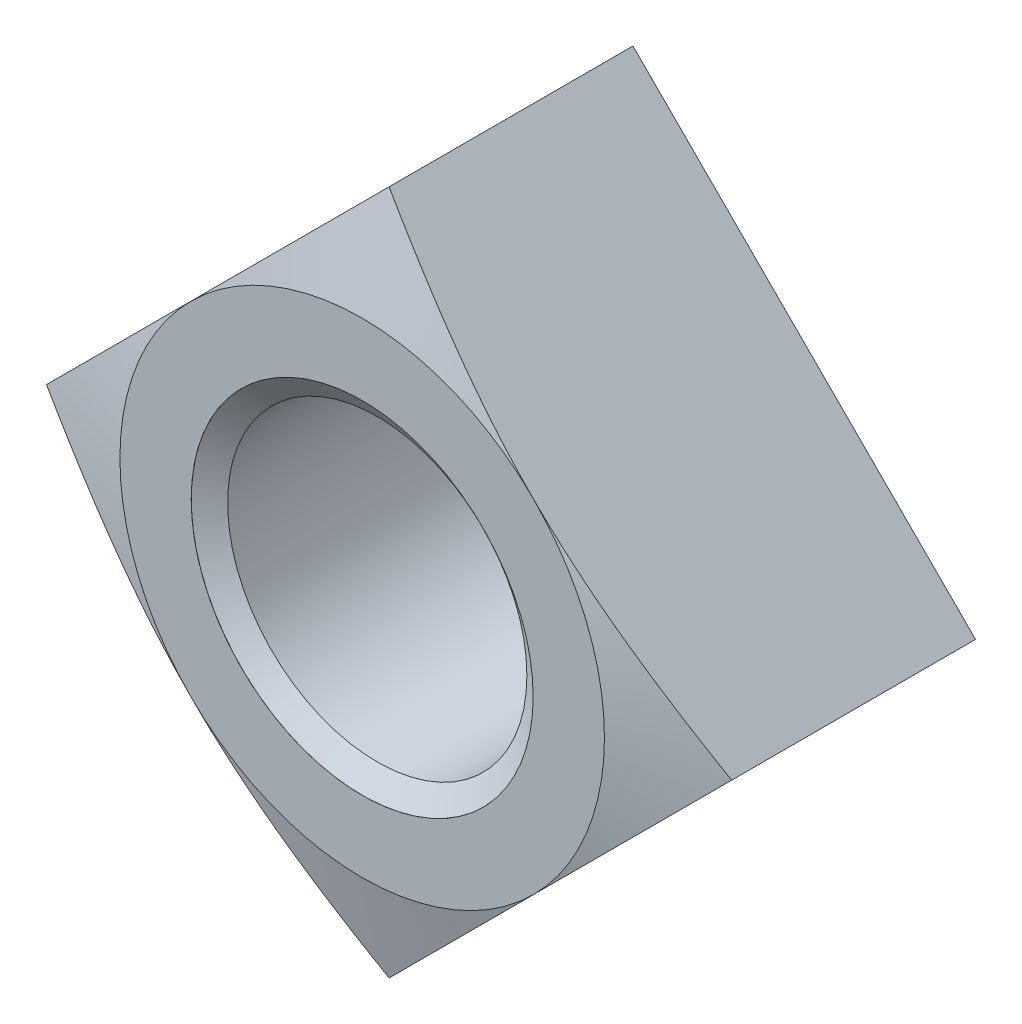
ISO-10303-21;
HEADER;
FILE_DESCRIPTION(('STEP AP214'),'2;1');
FILE_NAME('part.step','',(''),(''),'','','');
FILE_SCHEMA(('AUTOMOTIVE_DESIGN { 1 0 10303 214 1 1 1 1 }'));
ENDSEC;
DATA;
#1=APPLICATION_CONTEXT('core data for automotive mechanical design processes');
#2=APPLICATION_PROTOCOL_DEFINITION('international standard','automotive_design',2000,#1);
#3=PRODUCT_CONTEXT('',#1,'mechanical');
#4=PRODUCT('Part','Part','',(#3));
#5=PRODUCT_RELATED_PRODUCT_CATEGORY('part','',(#4));
#6=PRODUCT_DEFINITION_FORMATION('','',#4);
#7=PRODUCT_DEFINITION_CONTEXT('part definition',#1,'design');
#8=PRODUCT_DEFINITION('design','',#6,#7);
#9=PRODUCT_DEFINITION_SHAPE('','',#8);
#10=(LENGTH_UNIT() NAMED_UNIT(*) SI_UNIT(.MILLI.,.METRE.));
#11=(NAMED_UNIT(*) PLANE_ANGLE_UNIT() SI_UNIT($,.RADIAN.));
#12=(NAMED_UNIT(*) SI_UNIT($,.STERADIAN.) SOLID_ANGLE_UNIT());
#13=UNCERTAINTY_MEASURE_WITH_UNIT(LENGTH_MEASURE(1.E-05),#10,'distance_accuracy_value','');
#14=(GEOMETRIC_REPRESENTATION_CONTEXT(3) GLOBAL_UNCERTAINTY_ASSIGNED_CONTEXT((#13)) GLOBAL_UNIT_ASSIGNED_CONTEXT((#10,
#11,#12)) REPRESENTATION_CONTEXT('',''));
#15=CARTESIAN_POINT('',(0.,0.,0.));
#16=DIRECTION('',(0.,0.,1.));
#17=DIRECTION('',(1.,0.,0.));
#18=AXIS2_PLACEMENT_3D('',#15,#16,#17);
#19=CARTESIAN_POINT('',(0.,0.,-19.));
#20=DIRECTION('',(0.,0.,1.));
#21=DIRECTION('',(1.,0.,0.));
#22=AXIS2_PLACEMENT_3D('',#19,#20,#21);
#23=CYLINDRICAL_SURFACE('',#22,10.5);
#24=CARTESIAN_POINT('',(0.,0.,-1.05831130731455));
#25=DIRECTION('',(0.,0.,1.));
#26=DIRECTION('',(1.,0.,0.));
#27=AXIS2_PLACEMENT_3D('',#24,#25,#26);
#28=CIRCLE('',#27,10.5);
#29=CARTESIAN_POINT('',(10.5,0.,-1.05831130731455));
#30=VERTEX_POINT('',#29);
#31=EDGE_CURVE('E171',#30,#30,#28,.F.);
#32=ORIENTED_EDGE('',*,*,#31,.F.);
#33=EDGE_LOOP('',(#32));
#34=FACE_BOUND('',#33,.T.);
#35=CARTESIAN_POINT('',(0.,0.,-17.9406886926854));
#36=DIRECTION('',(0.,0.,-1.));
#37=DIRECTION('',(-1.,0.,0.));
#38=AXIS2_PLACEMENT_3D('',#35,#36,#37);
#39=CIRCLE('',#38,10.5);
#40=CARTESIAN_POINT('',(-10.5,0.,-17.9406886926854));
#41=VERTEX_POINT('',#40);
#42=EDGE_CURVE('E39',#41,#41,#39,.F.);
#43=ORIENTED_EDGE('',*,*,#42,.F.);
#44=EDGE_LOOP('',(#43));
#45=FACE_BOUND('',#44,.T.);
#46=ADVANCED_FACE('F34',(#34,#45),#23,.F.);
#47=CARTESIAN_POINT('',(0.,-24.0416305603426,-19.));
#48=DIRECTION('',(0.707106781186548,-0.707106781186547,0.));
#49=DIRECTION('',(0.707106781186547,0.707106781186548,0.));
#50=AXIS2_PLACEMENT_3D('',#47,#48,#49);
#51=PLANE('',#50);
#52=DIRECTION('',(0.,0.,1.));
#53=VECTOR('',#52,1.);
#54=CARTESIAN_POINT('',(24.0416305603426,0.,-19.));
#55=LINE('',#54,#53);
#56=CARTESIAN_POINT('',(24.0416305603426,0.,-19.));
#57=VERTEX_POINT('',#56);
#58=CARTESIAN_POINT('',(24.0416305603426,0.,-1.88679922204209));
#59=VERTEX_POINT('',#58);
#60=EDGE_CURVE('E163',#57,#59,#55,.T.);
#61=ORIENTED_EDGE('',*,*,#60,.T.);
#62=CARTESIAN_POINT('',(24.0418305603426,0.000200000000000547,-1.88685281210348));
#63=CARTESIAN_POINT('',(23.6810411055927,-0.360589454749866,-1.7901955422523));
#64=CARTESIAN_POINT('',(23.3199703646757,-0.721660195666852,-1.69560617213366));
#65=CARTESIAN_POINT('',(22.5971946492389,-1.44443591110365,-1.51127094193264));
#66=CARTESIAN_POINT('',(22.2354896459195,-1.80614091442308,-1.42152530799281));
#67=CARTESIAN_POINT('',(21.5111693163841,-2.5304612439585,-1.24753722288939));
#68=CARTESIAN_POINT('',(21.1485535479555,-2.89307701238706,-1.16329842941685));
#69=CARTESIAN_POINT('',(20.4226152754532,-3.61901528488943,-1.00123125126152));
#70=CARTESIAN_POINT('',(20.059292779392,-3.98233778095055,-0.92340279432868));
#71=CARTESIAN_POINT('',(18.9673670870529,-5.07426347328974,-0.700735025456504));
#72=CARTESIAN_POINT('',(18.2375962862967,-5.80403427404588,-0.566907203137075));
#73=CARTESIAN_POINT('',(17.1408011063925,-6.90082945395011,-0.394369210461961));
#74=CARTESIAN_POINT('',(16.7748732833449,-7.26675727699767,-0.341560024747929));
#75=CARTESIAN_POINT('',(16.0423433673301,-7.99928719301251,-0.24638041855238));
#76=CARTESIAN_POINT('',(15.6757412969734,-8.3658892633692,-0.204009654228861));
#77=CARTESIAN_POINT('',(14.9475096922545,-9.09412086808808,-0.131203886049738));
#78=CARTESIAN_POINT('',(14.5858887370372,-9.45574182330535,-0.100598181356072));
#79=CARTESIAN_POINT('',(13.8622417937111,-10.1793887666315,-0.0511623306157504));
#80=CARTESIAN_POINT('',(13.5002158065039,-10.5414147538387,-0.0323321584084118));
#81=CARTESIAN_POINT('',(12.7759417601421,-11.2656888002005,-0.00693322575574935));
#82=CARTESIAN_POINT('',(12.4136936978842,-11.6279368624584,-0.00036464075617388));
#83=CARTESIAN_POINT('',(11.68919235968,-12.3524382006626,0.000335069963156791));
#84=CARTESIAN_POINT('',(11.3269390837408,-12.7146914766018,-0.00553378866484579));
#85=CARTESIAN_POINT('',(10.6030026862981,-13.4386278740445,-0.0295412472541509));
#86=CARTESIAN_POINT('',(10.2413193587041,-13.8003112016385,-0.047667431293936));
#87=CARTESIAN_POINT('',(9.51835087963272,-14.5232796807099,-0.0957014604715472));
#88=CARTESIAN_POINT('',(9.15706573088783,-14.8845648294548,-0.12560938596275));
#89=CARTESIAN_POINT('',(8.07403908147058,-15.967591478872,-0.231960594779019));
#90=CARTESIAN_POINT('',(7.35308599932998,-16.6885445610126,-0.325032791109208));
#91=CARTESIAN_POINT('',(6.35641213329721,-17.6852184270454,-0.479473928689032));
#92=CARTESIAN_POINT('',(6.07939888362192,-17.9622316767207,-0.525167593839492));
#93=CARTESIAN_POINT('',(5.52582325233106,-18.5158073080115,-0.621550334840829));
#94=CARTESIAN_POINT('',(5.24926083918922,-18.7923697211534,-0.672239044697153));
#95=CARTESIAN_POINT('',(4.42016185809684,-19.6214687022458,-0.831140111044615));
#96=CARTESIAN_POINT('',(3.8682783950685,-20.1733521652741,-0.94617714320734));
#97=CARTESIAN_POINT('',(2.76265174549762,-21.278978814845,-1.19188048125466));
#98=CARTESIAN_POINT('',(2.20891926705389,-21.8327112932887,-1.32264211667029));
#99=CARTESIAN_POINT('',(1.37955839928319,-22.6620721610594,-1.52787262488177));
#100=CARTESIAN_POINT('',(1.1033603130542,-22.9382702472884,-1.59778417037341));
#101=CARTESIAN_POINT('',(0.551320402310434,-23.4903101580322,-1.74034210311989));
#102=CARTESIAN_POINT('',(0.275478573595275,-23.7661519867473,-1.81298845782032));
#103=CARTESIAN_POINT('',(-0.000200000000008303,-24.0418305603426,-1.88685281210348));
#104=B_SPLINE_CURVE_WITH_KNOTS('',3,(#62,#63,#64,#65,#66,#67,#68,#69,#70,#71,#72,#73,#74,#75,
#76,#77,#78,#79,#80,#81,#82,#83,#84,#85,#86,#87,#88,#89,#90,#91,#92,#93,#94,#95,#96,#97,#98,#99,
#100,#101,#102,#103),.UNSPECIFIED.,.F.,.F.,(4,2,2,2,2,2,2,2,2,2,2,2,2,2,2,2,2,2,2,2,4),(0.,
1.55792765895249,3.11592799104219,4.67495286100678,6.23396015700522,9.35537810496539,
10.9158569194478,12.4762843248233,14.0131299734936,15.5499722078745,17.0868364320978,
18.6236987222132,20.159006592055,21.6943249331254,24.7647903972788,25.948012582156,
27.1311481349084,29.4976960010644,31.8793921299765,33.0698149689814,34.2602236419983),.UNSPECIFIED.);
#105=CARTESIAN_POINT('',(12.0208152801713,-12.0208152801713,0.));
#106=VERTEX_POINT('',#105);
#107=EDGE_CURVE('E151',#59,#106,#104,.T.);
#108=ORIENTED_EDGE('',*,*,#107,.T.);
#109=CARTESIAN_POINT('',(0.,-24.0416305603426,-1.88679922204209));
#110=VERTEX_POINT('',#109);
#111=EDGE_CURVE('E60',#106,#110,#104,.T.);
#112=ORIENTED_EDGE('',*,*,#111,.T.);
#113=DIRECTION('',(0.,0.,1.));
#114=VECTOR('',#113,1.);
#115=CARTESIAN_POINT('',(0.,-24.0416305603426,-19.));
#116=LINE('',#115,#114);
#117=CARTESIAN_POINT('',(0.,-24.0416305603426,-19.));
#118=VERTEX_POINT('',#117);
#119=EDGE_CURVE('E111',#118,#110,#116,.T.);
#120=ORIENTED_EDGE('',*,*,#119,.F.);
#121=DIRECTION('',(0.707106781186547,0.707106781186548,0.));
#122=VECTOR('',#121,1.);
#123=CARTESIAN_POINT('',(0.,-24.0416305603426,-19.));
#124=LINE('',#123,#122);
#125=EDGE_CURVE('E152',#118,#57,#124,.T.);
#126=ORIENTED_EDGE('',*,*,#125,.T.);
#127=EDGE_LOOP('',(#61,#108,#112,#120,#126));
#128=FACE_BOUND('',#127,.T.);
#129=ADVANCED_FACE('F36',(#128),#51,.T.);
#130=CARTESIAN_POINT('',(-24.0416305603426,0.,-19.));
#131=DIRECTION('',(-0.707106781186548,-0.707106781186547,0.));
#132=DIRECTION('',(0.707106781186547,-0.707106781186548,0.));
#133=AXIS2_PLACEMENT_3D('',#130,#131,#132);
#134=PLANE('',#133);
#135=ORIENTED_EDGE('',*,*,#119,.T.);
#136=CARTESIAN_POINT('',(0.00019999999999076,-24.0418305603426,-1.88685281210348));
#137=CARTESIAN_POINT('',(-0.360589454749876,-23.6810411055927,-1.79019554225231));
#138=CARTESIAN_POINT('',(-0.721660195666861,-23.3199703646758,-1.69560617213366));
#139=CARTESIAN_POINT('',(-1.44443591110366,-22.597194649239,-1.51127094193264));
#140=CARTESIAN_POINT('',(-1.80614091442309,-22.2354896459195,-1.42152530799281));
#141=CARTESIAN_POINT('',(-2.53046124395851,-21.5111693163841,-1.24753722288939));
#142=CARTESIAN_POINT('',(-2.89307701238707,-21.1485535479556,-1.16329842941685));
#143=CARTESIAN_POINT('',(-3.61901528488944,-20.4226152754532,-1.00123125126152));
#144=CARTESIAN_POINT('',(-3.98233778095056,-20.0592927793921,-0.923402794328685));
#145=CARTESIAN_POINT('',(-5.07426347328975,-18.9673670870529,-0.700735025456508));
#146=CARTESIAN_POINT('',(-5.80403427404589,-18.2375962862967,-0.566907203137081));
#147=CARTESIAN_POINT('',(-6.90082945395012,-17.1408011063925,-0.394369210461966));
#148=CARTESIAN_POINT('',(-7.26675727699768,-16.7748732833449,-0.341560024747933));
#149=CARTESIAN_POINT('',(-7.99928719301252,-16.0423433673301,-0.246380418552383));
#150=CARTESIAN_POINT('',(-8.36588926336921,-15.6757412969734,-0.204009654228866));
#151=CARTESIAN_POINT('',(-9.09412086808809,-14.9475096922545,-0.131203886049742));
#152=CARTESIAN_POINT('',(-9.45574182330536,-14.5858887370373,-0.100598181356076));
#153=CARTESIAN_POINT('',(-10.1793887666315,-13.8622417937111,-0.0511623306157539));
#154=CARTESIAN_POINT('',(-10.5414147538387,-13.5002158065039,-0.0323321584084156));
#155=CARTESIAN_POINT('',(-11.2656888002005,-12.7759417601421,-0.00693322575575295));
#156=CARTESIAN_POINT('',(-11.6279368624584,-12.4136936978842,-0.000364640756177037));
#157=CARTESIAN_POINT('',(-12.3524382006627,-11.68919235968,0.000335069963153438));
#158=CARTESIAN_POINT('',(-12.7146914766018,-11.3269390837408,-0.00553378866484968));
#159=CARTESIAN_POINT('',(-13.4386278740445,-10.6030026862981,-0.0295412472541545));
#160=CARTESIAN_POINT('',(-13.8003112016385,-10.2413193587041,-0.0476674312939388));
#161=CARTESIAN_POINT('',(-14.5232796807099,-9.51835087963272,-0.0957014604715495));
#162=CARTESIAN_POINT('',(-14.8845648294548,-9.15706573088784,-0.125609385962753));
#163=CARTESIAN_POINT('',(-15.967591478872,-8.07403908147058,-0.231960594779022));
#164=CARTESIAN_POINT('',(-16.6885445610126,-7.35308599932998,-0.325032791109213));
#165=CARTESIAN_POINT('',(-17.6852184270454,-6.3564121332972,-0.479473928689036));
#166=CARTESIAN_POINT('',(-17.9622316767207,-6.07939888362192,-0.525167593839495));
#167=CARTESIAN_POINT('',(-18.5158073080116,-5.52582325233107,-0.621550334840832));
#168=CARTESIAN_POINT('',(-18.7923697211534,-5.24926083918923,-0.672239044697156));
#169=CARTESIAN_POINT('',(-19.6214687022458,-4.42016185809684,-0.831140111044617));
#170=CARTESIAN_POINT('',(-20.1733521652741,-3.8682783950685,-0.946177143207343));
#171=CARTESIAN_POINT('',(-21.278978814845,-2.76265174549763,-1.19188048125466));
#172=CARTESIAN_POINT('',(-21.8327112932887,-2.20891926705389,-1.32264211667029));
#173=CARTESIAN_POINT('',(-22.6620721610594,-1.3795583992832,-1.52787262488177));
#174=CARTESIAN_POINT('',(-22.9382702472884,-1.1033603130542,-1.59778417037341));
#175=CARTESIAN_POINT('',(-23.4903101580322,-0.551320402310435,-1.74034210311989));
#176=CARTESIAN_POINT('',(-23.7661519867473,-0.275478573595277,-1.81298845782033));
#177=CARTESIAN_POINT('',(-24.0418305603426,0.000200000000004328,-1.88685281210348));
#178=B_SPLINE_CURVE_WITH_KNOTS('',3,(#136,#137,#138,#139,#140,#141,#142,#143,#144,#145,#146,
#147,#148,#149,#150,#151,#152,#153,#154,#155,#156,#157,#158,#159,#160,#161,#162,#163,#164,#165,
#166,#167,#168,#169,#170,#171,#172,#173,#174,#175,#176,#177),.UNSPECIFIED.,.F.,.F.,(4,2,2,2,2,2,
2,2,2,2,2,2,2,2,2,2,2,2,2,2,4),(0.,1.55792765895249,3.11592799104219,4.67495286100679,
6.23396015700523,9.3553781049654,10.9158569194478,12.4762843248233,14.0131299734936,
15.5499722078745,17.0868364320978,18.6236987222133,20.159006592055,21.6943249331254,
24.7647903972788,25.948012582156,27.1311481349084,29.4976960010644,31.8793921299765,
33.0698149689814,34.2602236419983),.UNSPECIFIED.);
#179=CARTESIAN_POINT('',(-12.0208152801713,-12.0208152801713,0.));
#180=VERTEX_POINT('',#179);
#181=EDGE_CURVE('E119',#110,#180,#178,.T.);
#182=ORIENTED_EDGE('',*,*,#181,.T.);
#183=CARTESIAN_POINT('',(-24.0416305603426,0.,-1.8867992220421));
#184=VERTEX_POINT('',#183);
#185=EDGE_CURVE('E107',#180,#184,#178,.T.);
#186=ORIENTED_EDGE('',*,*,#185,.T.);
#187=DIRECTION('',(0.,0.,1.));
#188=VECTOR('',#187,1.);
#189=CARTESIAN_POINT('',(-24.0416305603426,0.,-19.));
#190=LINE('',#189,#188);
#191=CARTESIAN_POINT('',(-24.0416305603426,0.,-19.));
#192=VERTEX_POINT('',#191);
#193=EDGE_CURVE('E118',#192,#184,#190,.T.);
#194=ORIENTED_EDGE('',*,*,#193,.F.);
#195=DIRECTION('',(0.707106781186547,-0.707106781186548,0.));
#196=VECTOR('',#195,1.);
#197=CARTESIAN_POINT('',(-24.0416305603426,0.,-19.));
#198=LINE('',#197,#196);
#199=EDGE_CURVE('E160',#192,#118,#198,.T.);
#200=ORIENTED_EDGE('',*,*,#199,.T.);
#201=EDGE_LOOP('',(#135,#182,#186,#194,#200));
#202=FACE_BOUND('',#201,.T.);
#203=ADVANCED_FACE('F211',(#202),#134,.T.);
#204=CARTESIAN_POINT('',(0.,24.0416305603426,-19.));
#205=DIRECTION('',(-0.707106781186548,0.707106781186547,0.));
#206=DIRECTION('',(-0.707106781186547,-0.707106781186548,0.));
#207=AXIS2_PLACEMENT_3D('',#204,#205,#206);
#208=PLANE('',#207);
#209=ORIENTED_EDGE('',*,*,#193,.T.);
#210=CARTESIAN_POINT('',(-24.0418305603426,-0.000199999999997945,-1.88685281210348));
#211=CARTESIAN_POINT('',(-23.6810411055928,0.36058945474987,-1.7901955422523));
#212=CARTESIAN_POINT('',(-23.3199703646758,0.721660195666857,-1.69560617213366));
#213=CARTESIAN_POINT('',(-22.597194649239,1.44443591110366,-1.51127094193265));
#214=CARTESIAN_POINT('',(-22.2354896459195,1.80614091442308,-1.42152530799282));
#215=CARTESIAN_POINT('',(-21.5111693163841,2.53046124395851,-1.24753722288939));
#216=CARTESIAN_POINT('',(-21.1485535479556,2.89307701238707,-1.16329842941685));
#217=CARTESIAN_POINT('',(-20.4226152754532,3.61901528488944,-1.00123125126152));
#218=CARTESIAN_POINT('',(-20.0592927793921,3.98233778095055,-0.923402794328686));
#219=CARTESIAN_POINT('',(-18.9673670870529,5.07426347328975,-0.70073502545651));
#220=CARTESIAN_POINT('',(-18.2375962862967,5.80403427404589,-0.566907203137083));
#221=CARTESIAN_POINT('',(-17.1408011063925,6.90082945395012,-0.394369210461968));
#222=CARTESIAN_POINT('',(-16.774873283345,7.26675727699768,-0.341560024747936));
#223=CARTESIAN_POINT('',(-16.0423433673301,7.99928719301252,-0.246380418552386));
#224=CARTESIAN_POINT('',(-15.6757412969734,8.3658892633692,-0.204009654228868));
#225=CARTESIAN_POINT('',(-14.9475096922545,9.09412086808809,-0.131203886049744));
#226=CARTESIAN_POINT('',(-14.5858887370373,9.45574182330536,-0.100598181356077));
#227=CARTESIAN_POINT('',(-13.8622417937111,10.1793887666315,-0.0511623306157549));
#228=CARTESIAN_POINT('',(-13.5002158065039,10.5414147538387,-0.0323321584084172));
#229=CARTESIAN_POINT('',(-12.7759417601421,11.2656888002005,-0.00693322575575509));
#230=CARTESIAN_POINT('',(-12.4136936978842,11.6279368624584,-0.000364640756179214));
#231=CARTESIAN_POINT('',(-11.68919235968,12.3524382006627,0.000335069963151896));
#232=CARTESIAN_POINT('',(-11.3269390837408,12.7146914766018,-0.00553378866485057));
#233=CARTESIAN_POINT('',(-10.6030026862981,13.4386278740445,-0.0295412472541554));
#234=CARTESIAN_POINT('',(-10.2413193587041,13.8003112016385,-0.0476674312939405));
#235=CARTESIAN_POINT('',(-9.51835087963273,14.5232796807099,-0.0957014604715515));
#236=CARTESIAN_POINT('',(-9.15706573088785,14.8845648294548,-0.125609385962755));
#237=CARTESIAN_POINT('',(-8.07403908147059,15.967591478872,-0.231960594779023));
#238=CARTESIAN_POINT('',(-7.35308599932999,16.6885445610126,-0.325032791109213));
#239=CARTESIAN_POINT('',(-6.35641213329722,17.6852184270454,-0.479473928689037));
#240=CARTESIAN_POINT('',(-6.07939888362193,17.9622316767207,-0.525167593839497));
#241=CARTESIAN_POINT('',(-5.52582325233107,18.5158073080116,-0.621550334840834));
#242=CARTESIAN_POINT('',(-5.24926083918923,18.7923697211534,-0.672239044697157));
#243=CARTESIAN_POINT('',(-4.42016185809685,19.6214687022458,-0.831140111044618));
#244=CARTESIAN_POINT('',(-3.86827839506852,20.1733521652741,-0.946177143207344));
#245=CARTESIAN_POINT('',(-2.76265174549764,21.278978814845,-1.19188048125466));
#246=CARTESIAN_POINT('',(-2.2089192670539,21.8327112932887,-1.3226421166703));
#247=CARTESIAN_POINT('',(-1.37955839928321,22.6620721610594,-1.52787262488177));
#248=CARTESIAN_POINT('',(-1.10336031305422,22.9382702472884,-1.59778417037341));
#249=CARTESIAN_POINT('',(-0.551320402310458,23.4903101580322,-1.74034210311989));
#250=CARTESIAN_POINT('',(-0.275478573595299,23.7661519867473,-1.81298845782033));
#251=CARTESIAN_POINT('',(0.000199999999984789,24.0418305603426,-1.88685281210348));
#252=B_SPLINE_CURVE_WITH_KNOTS('',3,(#210,#211,#212,#213,#214,#215,#216,#217,#218,#219,#220,
#221,#222,#223,#224,#225,#226,#227,#228,#229,#230,#231,#232,#233,#234,#235,#236,#237,#238,#239,
#240,#241,#242,#243,#244,#245,#246,#247,#248,#249,#250,#251),.UNSPECIFIED.,.F.,.F.,(4,2,2,2,2,2,
2,2,2,2,2,2,2,2,2,2,2,2,2,2,4),(0.,1.55792765895249,3.11592799104219,4.67495286100678,
6.23396015700522,9.35537810496539,10.9158569194478,12.4762843248233,14.0131299734936,
15.5499722078745,17.0868364320978,18.6236987222133,20.159006592055,21.6943249331254,
24.7647903972788,25.948012582156,27.1311481349084,29.4976960010644,31.8793921299765,
33.0698149689814,34.2602236419983),.UNSPECIFIED.);
#253=CARTESIAN_POINT('',(-12.0208152801713,12.0208152801713,0.));
#254=VERTEX_POINT('',#253);
#255=EDGE_CURVE('E100',#184,#254,#252,.T.);
#256=ORIENTED_EDGE('',*,*,#255,.T.);
#257=CARTESIAN_POINT('',(0.,24.0416305603426,-1.8867992220421));
#258=VERTEX_POINT('',#257);
#259=EDGE_CURVE('E89',#254,#258,#252,.T.);
#260=ORIENTED_EDGE('',*,*,#259,.T.);
#261=DIRECTION('',(0.,0.,1.));
#262=VECTOR('',#261,1.);
#263=CARTESIAN_POINT('',(0.,24.0416305603426,-19.));
#264=LINE('',#263,#262);
#265=CARTESIAN_POINT('',(0.,24.0416305603426,-19.));
#266=VERTEX_POINT('',#265);
#267=EDGE_CURVE('E167',#266,#258,#264,.T.);
#268=ORIENTED_EDGE('',*,*,#267,.F.);
#269=DIRECTION('',(-0.707106781186547,-0.707106781186548,0.));
#270=VECTOR('',#269,1.);
#271=CARTESIAN_POINT('',(0.,24.0416305603426,-19.));
#272=LINE('',#271,#270);
#273=EDGE_CURVE('E158',#266,#192,#272,.T.);
#274=ORIENTED_EDGE('',*,*,#273,.T.);
#275=EDGE_LOOP('',(#209,#256,#260,#268,#274));
#276=FACE_BOUND('',#275,.T.);
#277=ADVANCED_FACE('F116',(#276),#208,.T.);
#278=CARTESIAN_POINT('',(24.0416305603426,0.,-19.));
#279=DIRECTION('',(0.707106781186548,0.707106781186547,0.));
#280=DIRECTION('',(-0.707106781186547,0.707106781186548,0.));
#281=AXIS2_PLACEMENT_3D('',#278,#279,#280);
#282=PLANE('',#281);
#283=ORIENTED_EDGE('',*,*,#267,.T.);
#284=CARTESIAN_POINT('',(-0.00020000000001421,24.0418305603426,-1.88685281210348));
#285=CARTESIAN_POINT('',(0.360589454749853,23.6810411055928,-1.79019554225231));
#286=CARTESIAN_POINT('',(0.721660195666839,23.3199703646758,-1.69560617213367));
#287=CARTESIAN_POINT('',(1.44443591110364,22.597194649239,-1.51127094193265));
#288=CARTESIAN_POINT('',(1.80614091442306,22.2354896459195,-1.42152530799282));
#289=CARTESIAN_POINT('',(2.53046124395849,21.5111693163841,-1.24753722288939));
#290=CARTESIAN_POINT('',(2.89307701238705,21.1485535479556,-1.16329842941685));
#291=CARTESIAN_POINT('',(3.61901528488941,20.4226152754532,-1.00123125126152));
#292=CARTESIAN_POINT('',(3.98233778095053,20.0592927793921,-0.923402794328686));
#293=CARTESIAN_POINT('',(5.07426347328973,18.9673670870529,-0.700735025456508));
#294=CARTESIAN_POINT('',(5.80403427404586,18.2375962862967,-0.566907203137078));
#295=CARTESIAN_POINT('',(6.9008294539501,17.1408011063925,-0.394369210461964));
#296=CARTESIAN_POINT('',(7.26675727699766,16.7748732833449,-0.341560024747933));
#297=CARTESIAN_POINT('',(7.9992871930125,16.0423433673301,-0.246380418552383));
#298=CARTESIAN_POINT('',(8.36588926336919,15.6757412969734,-0.204009654228864));
#299=CARTESIAN_POINT('',(9.09412086808807,14.9475096922545,-0.13120388604974));
#300=CARTESIAN_POINT('',(9.45574182330534,14.5858887370373,-0.100598181356073));
#301=CARTESIAN_POINT('',(10.1793887666315,13.8622417937111,-0.0511623306157514));
#302=CARTESIAN_POINT('',(10.5414147538387,13.5002158065039,-0.0323321584084141));
#303=CARTESIAN_POINT('',(11.2656888002005,12.7759417601421,-0.00693322575575172));
#304=CARTESIAN_POINT('',(11.6279368624584,12.4136936978842,-0.000364640756175019));
#305=CARTESIAN_POINT('',(12.3524382006626,11.68919235968,0.000335069963156999));
#306=CARTESIAN_POINT('',(12.7146914766018,11.3269390837408,-0.00553378866484543));
#307=CARTESIAN_POINT('',(13.4386278740445,10.6030026862981,-0.0295412472541503));
#308=CARTESIAN_POINT('',(13.8003112016385,10.2413193587041,-0.0476674312939355));
#309=CARTESIAN_POINT('',(14.5232796807099,9.51835087963273,-0.0957014604715464));
#310=CARTESIAN_POINT('',(14.8845648294548,9.15706573088784,-0.125609385962749));
#311=CARTESIAN_POINT('',(15.967591478872,8.07403908147058,-0.231960594779018));
#312=CARTESIAN_POINT('',(16.6885445610126,7.35308599932998,-0.325032791109209));
#313=CARTESIAN_POINT('',(17.6852184270454,6.35641213329721,-0.479473928689031));
#314=CARTESIAN_POINT('',(17.9622316767207,6.07939888362193,-0.52516759383949));
#315=CARTESIAN_POINT('',(18.5158073080115,5.52582325233107,-0.621550334840826));
#316=CARTESIAN_POINT('',(18.7923697211534,5.24926083918923,-0.67223904469715));
#317=CARTESIAN_POINT('',(19.6214687022457,4.42016185809685,-0.831140111044612));
#318=CARTESIAN_POINT('',(20.1733521652741,3.86827839506851,-0.946177143207337));
#319=CARTESIAN_POINT('',(21.278978814845,2.76265174549764,-1.19188048125465));
#320=CARTESIAN_POINT('',(21.8327112932887,2.2089192670539,-1.32264211667029));
#321=CARTESIAN_POINT('',(22.6620721610594,1.37955839928321,-1.52787262488176));
#322=CARTESIAN_POINT('',(22.9382702472884,1.10336031305421,-1.5977841703734));
#323=CARTESIAN_POINT('',(23.4903101580322,0.55132040231045,-1.74034210311989));
#324=CARTESIAN_POINT('',(23.7661519867473,0.27547857359529,-1.81298845782032));
#325=CARTESIAN_POINT('',(24.0418305603426,-0.000199999999993617,-1.88685281210348));
#326=B_SPLINE_CURVE_WITH_KNOTS('',3,(#284,#285,#286,#287,#288,#289,#290,#291,#292,#293,#294,
#295,#296,#297,#298,#299,#300,#301,#302,#303,#304,#305,#306,#307,#308,#309,#310,#311,#312,#313,
#314,#315,#316,#317,#318,#319,#320,#321,#322,#323,#324,#325),.UNSPECIFIED.,.F.,.F.,(4,2,2,2,2,2,
2,2,2,2,2,2,2,2,2,2,2,2,2,2,4),(0.,1.55792765895249,3.11592799104219,4.67495286100678,
6.23396015700522,9.3553781049654,10.9158569194478,12.4762843248234,14.0131299734936,
15.5499722078745,17.0868364320978,18.6236987222133,20.159006592055,21.6943249331254,
24.7647903972788,25.948012582156,27.1311481349084,29.4976960010644,31.8793921299765,
33.0698149689814,34.2602236419983),.UNSPECIFIED.);
#327=CARTESIAN_POINT('',(12.0208152801713,12.0208152801713,0.));
#328=VERTEX_POINT('',#327);
#329=EDGE_CURVE('E96',#258,#328,#326,.T.);
#330=ORIENTED_EDGE('',*,*,#329,.T.);
#331=EDGE_CURVE('E52',#328,#59,#326,.T.);
#332=ORIENTED_EDGE('',*,*,#331,.T.);
#333=ORIENTED_EDGE('',*,*,#60,.F.);
#334=DIRECTION('',(-0.707106781186547,0.707106781186548,0.));
#335=VECTOR('',#334,1.);
#336=CARTESIAN_POINT('',(24.0416305603426,0.,-19.));
#337=LINE('',#336,#335);
#338=EDGE_CURVE('E155',#57,#266,#337,.T.);
#339=ORIENTED_EDGE('',*,*,#338,.T.);
#340=EDGE_LOOP('',(#283,#330,#332,#333,#339));
#341=FACE_BOUND('',#340,.T.);
#342=ADVANCED_FACE('F199',(#341),#282,.T.);
#343=CARTESIAN_POINT('',(0.,-24.0416305603426,0.));
#344=DIRECTION('',(0.,0.,-1.));
#345=DIRECTION('',(-1.,0.,0.));
#346=AXIS2_PLACEMENT_3D('',#343,#344,#345);
#347=PLANE('',#346);
#348=CARTESIAN_POINT('',(0.,0.,0.));
#349=DIRECTION('',(0.,0.,-1.));
#350=DIRECTION('',(-1.,0.,0.));
#351=AXIS2_PLACEMENT_3D('',#348,#349,#350);
#352=CIRCLE('',#351,12.);
#353=CARTESIAN_POINT('',(-12.,0.,0.));
#354=VERTEX_POINT('',#353);
#355=EDGE_CURVE('E113',#354,#354,#352,.F.);
#356=ORIENTED_EDGE('',*,*,#355,.F.);
#357=EDGE_LOOP('',(#356));
#358=FACE_BOUND('',#357,.T.);
#359=CARTESIAN_POINT('',(0.,0.,0.));
#360=DIRECTION('',(0.,0.,1.));
#361=DIRECTION('',(1.,0.,0.));
#362=AXIS2_PLACEMENT_3D('',#359,#360,#361);
#363=CIRCLE('',#362,17.);
#364=EDGE_CURVE('E93',#328,#254,#363,.T.);
#365=ORIENTED_EDGE('',*,*,#364,.T.);
#366=CARTESIAN_POINT('',(0.,0.,0.));
#367=DIRECTION('',(0.,0.,-1.));
#368=DIRECTION('',(-1.,0.,0.));
#369=AXIS2_PLACEMENT_3D('',#366,#367,#368);
#370=CIRCLE('',#369,17.);
#371=EDGE_CURVE('E46',#180,#254,#370,.T.);
#372=ORIENTED_EDGE('',*,*,#371,.F.);
#373=EDGE_CURVE('E44',#106,#180,#370,.T.);
#374=ORIENTED_EDGE('',*,*,#373,.F.);
#375=EDGE_CURVE('E11',#328,#106,#370,.T.);
#376=ORIENTED_EDGE('',*,*,#375,.F.);
#377=EDGE_LOOP('',(#365,#372,#374,#376));
#378=FACE_BOUND('',#377,.T.);
#379=ADVANCED_FACE('F112',(#358,#378),#347,.F.);
#380=CARTESIAN_POINT('',(0.,-24.0416305603426,-19.));
#381=DIRECTION('',(0.,0.,-1.));
#382=DIRECTION('',(-1.,0.,0.));
#383=AXIS2_PLACEMENT_3D('',#380,#381,#382);
#384=PLANE('',#383);
#385=CARTESIAN_POINT('',(0.,0.,-19.));
#386=DIRECTION('',(0.,0.,-1.));
#387=DIRECTION('',(-1.,0.,0.));
#388=AXIS2_PLACEMENT_3D('',#385,#386,#387);
#389=CIRCLE('',#388,12.);
#390=CARTESIAN_POINT('',(-12.,0.,-19.));
#391=VERTEX_POINT('',#390);
#392=EDGE_CURVE('E176',#391,#391,#389,.F.);
#393=ORIENTED_EDGE('',*,*,#392,.T.);
#394=EDGE_LOOP('',(#393));
#395=FACE_BOUND('',#394,.T.);
#396=ORIENTED_EDGE('',*,*,#125,.F.);
#397=ORIENTED_EDGE('',*,*,#199,.F.);
#398=ORIENTED_EDGE('',*,*,#273,.F.);
#399=ORIENTED_EDGE('',*,*,#338,.F.);
#400=EDGE_LOOP('',(#396,#397,#398,#399));
#401=FACE_BOUND('',#400,.T.);
#402=ADVANCED_FACE('F198',(#395,#401),#384,.T.);
#403=CARTESIAN_POINT('',(0.,0.,0.));
#404=DIRECTION('',(0.,0.,-1.));
#405=DIRECTION('',(-1.,0.,0.));
#406=AXIS2_PLACEMENT_3D('',#403,#404,#405);
#407=CONICAL_SURFACE('',#406,17.,1.30899693899575);
#408=ORIENTED_EDGE('',*,*,#371,.T.);
#409=ORIENTED_EDGE('',*,*,#255,.F.);
#410=ORIENTED_EDGE('',*,*,#185,.F.);
#411=EDGE_LOOP('',(#408,#409,#410));
#412=FACE_BOUND('',#411,.T.);
#413=ADVANCED_FACE('F105',(#412),#407,.T.);
#414=ORIENTED_EDGE('',*,*,#373,.T.);
#415=ORIENTED_EDGE('',*,*,#181,.F.);
#416=ORIENTED_EDGE('',*,*,#111,.F.);
#417=EDGE_LOOP('',(#414,#415,#416));
#418=FACE_BOUND('',#417,.T.);
#419=ADVANCED_FACE('F246',(#418),#407,.T.);
#420=ORIENTED_EDGE('',*,*,#331,.F.);
#421=ORIENTED_EDGE('',*,*,#375,.T.);
#422=ORIENTED_EDGE('',*,*,#107,.F.);
#423=EDGE_LOOP('',(#420,#421,#422));
#424=FACE_BOUND('',#423,.T.);
#425=ADVANCED_FACE('F141',(#424),#407,.T.);
#426=ORIENTED_EDGE('',*,*,#364,.F.);
#427=ORIENTED_EDGE('',*,*,#329,.F.);
#428=ORIENTED_EDGE('',*,*,#259,.F.);
#429=EDGE_LOOP('',(#426,#427,#428));
#430=FACE_BOUND('',#429,.T.);
#431=ADVANCED_FACE('F91',(#430),#407,.T.);
#432=CARTESIAN_POINT('',(0.,0.,-25.0375057290932));
#433=DIRECTION('',(0.,0.,1.));
#434=DIRECTION('',(1.,0.,0.));
#435=AXIS2_PLACEMENT_3D('',#432,#433,#434);
#436=CYLINDRICAL_SURFACE('',#435,12.);
#437=CARTESIAN_POINT('',(0.,0.,-0.00799999999999412));
#438=DIRECTION('',(0.,0.,1.));
#439=DIRECTION('',(1.,0.,0.));
#440=AXIS2_PLACEMENT_3D('',#437,#438,#439);
#441=CIRCLE('',#440,12.);
#442=CARTESIAN_POINT('',(12.,0.,-0.00799999999999412));
#443=VERTEX_POINT('',#442);
#444=EDGE_CURVE('E174',#443,#443,#441,.T.);
#445=ORIENTED_EDGE('',*,*,#444,.F.);
#446=EDGE_LOOP('',(#445));
#447=FACE_BOUND('',#446,.T.);
#448=ORIENTED_EDGE('',*,*,#355,.T.);
#449=EDGE_LOOP('',(#448));
#450=FACE_BOUND('',#449,.T.);
#451=ADVANCED_FACE('F140',(#447,#450),#436,.F.);
#452=CARTESIAN_POINT('',(0.,0.,-1.16334243804601));
#453=DIRECTION('',(0.,0.,1.));
#454=DIRECTION('',(1.,0.,0.));
#455=AXIS2_PLACEMENT_3D('',#452,#453,#454);
#456=CONICAL_SURFACE('',#455,10.35,0.959931088596883);
#457=ORIENTED_EDGE('',*,*,#444,.T.);
#458=EDGE_LOOP('',(#457));
#459=FACE_BOUND('',#458,.T.);
#460=ORIENTED_EDGE('',*,*,#31,.T.);
#461=EDGE_LOOP('',(#460));
#462=FACE_BOUND('',#461,.T.);
#463=ADVANCED_FACE('F190',(#459,#462),#456,.F.);
#464=CARTESIAN_POINT('',(0.,0.,-18.991));
#465=DIRECTION('',(0.,0.,-1.));
#466=DIRECTION('',(-1.,0.,0.));
#467=AXIS2_PLACEMENT_3D('',#464,#465,#466);
#468=CONICAL_SURFACE('',#467,12.,0.959931088596881);
#469=CARTESIAN_POINT('',(0.,0.,-18.991));
#470=DIRECTION('',(0.,0.,1.));
#471=DIRECTION('',(1.,0.,0.));
#472=AXIS2_PLACEMENT_3D('',#469,#470,#471);
#473=CIRCLE('',#472,12.);
#474=CARTESIAN_POINT('',(12.,0.,-18.991));
#475=VERTEX_POINT('',#474);
#476=EDGE_CURVE('E178',#475,#475,#473,.T.);
#477=ORIENTED_EDGE('',*,*,#476,.F.);
#478=EDGE_LOOP('',(#477));
#479=FACE_BOUND('',#478,.T.);
#480=ORIENTED_EDGE('',*,*,#42,.T.);
#481=EDGE_LOOP('',(#480));
#482=FACE_BOUND('',#481,.T.);
#483=ADVANCED_FACE('F217',(#479,#482),#468,.F.);
#484=CARTESIAN_POINT('',(0.,0.,-25.0375057290932));
#485=DIRECTION('',(0.,0.,1.));
#486=DIRECTION('',(1.,0.,0.));
#487=AXIS2_PLACEMENT_3D('',#484,#485,#486);
#488=CYLINDRICAL_SURFACE('',#487,12.);
#489=ORIENTED_EDGE('',*,*,#392,.F.);
#490=EDGE_LOOP('',(#489));
#491=FACE_BOUND('',#490,.T.);
#492=ORIENTED_EDGE('',*,*,#476,.T.);
#493=EDGE_LOOP('',(#492));
#494=FACE_BOUND('',#493,.T.);
#495=ADVANCED_FACE('F219',(#491,#494),#488,.F.);
#496=CLOSED_SHELL('',(#46,#129,#203,#277,#342,#379,#402,#413,#419,#425,#431,#451,#463,#483,#495));
#497=MANIFOLD_SOLID_BREP('B2',#496);
#498=ADVANCED_BREP_SHAPE_REPRESENTATION('',(#18,#497),#14);
#499=SHAPE_DEFINITION_REPRESENTATION(#9,#498);
ENDSEC;
END-ISO-10303-21;
